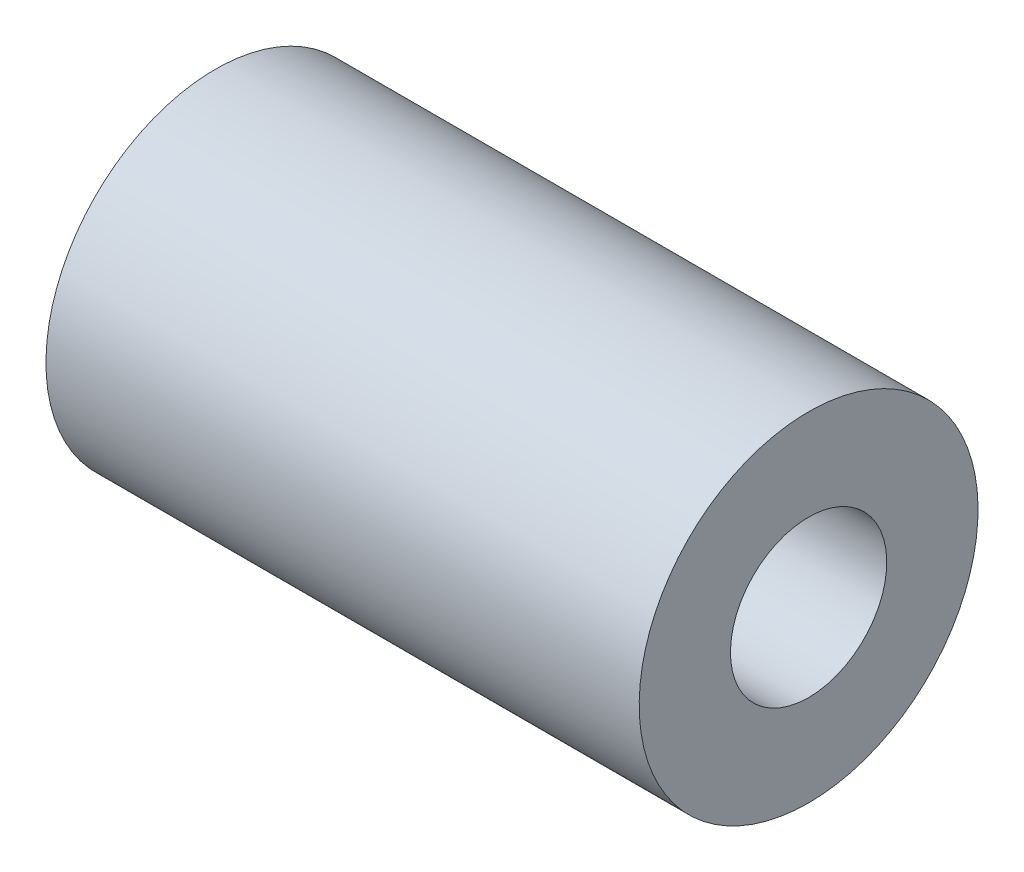
ISO-10303-21;
HEADER;
FILE_DESCRIPTION(('STEP AP214'),'2;1');
FILE_NAME('part.step','',(''),(''),'','','');
FILE_SCHEMA(('AUTOMOTIVE_DESIGN { 1 0 10303 214 1 1 1 1 }'));
ENDSEC;
DATA;
#1=APPLICATION_CONTEXT('core data for automotive mechanical design processes');
#2=APPLICATION_PROTOCOL_DEFINITION('international standard','automotive_design',2000,#1);
#3=PRODUCT_CONTEXT('',#1,'mechanical');
#4=PRODUCT('Part','Part','',(#3));
#5=PRODUCT_RELATED_PRODUCT_CATEGORY('part','',(#4));
#6=PRODUCT_DEFINITION_FORMATION('','',#4);
#7=PRODUCT_DEFINITION_CONTEXT('part definition',#1,'design');
#8=PRODUCT_DEFINITION('design','',#6,#7);
#9=PRODUCT_DEFINITION_SHAPE('','',#8);
#10=(LENGTH_UNIT() NAMED_UNIT(*) SI_UNIT(.MILLI.,.METRE.));
#11=(NAMED_UNIT(*) PLANE_ANGLE_UNIT() SI_UNIT($,.RADIAN.));
#12=(NAMED_UNIT(*) SI_UNIT($,.STERADIAN.) SOLID_ANGLE_UNIT());
#13=UNCERTAINTY_MEASURE_WITH_UNIT(LENGTH_MEASURE(1.E-05),#10,'distance_accuracy_value','');
#14=(GEOMETRIC_REPRESENTATION_CONTEXT(3) GLOBAL_UNCERTAINTY_ASSIGNED_CONTEXT((#13)) GLOBAL_UNIT_ASSIGNED_CONTEXT((#10,
#11,#12)) REPRESENTATION_CONTEXT('',''));
#15=CARTESIAN_POINT('',(0.,0.,0.));
#16=DIRECTION('',(0.,0.,1.));
#17=DIRECTION('',(1.,0.,0.));
#18=AXIS2_PLACEMENT_3D('',#15,#16,#17);
#19=CARTESIAN_POINT('',(-112.26450703781,38.1,0.));
#20=DIRECTION('',(-1.,0.,0.));
#21=DIRECTION('',(0.,-1.,0.));
#22=AXIS2_PLACEMENT_3D('',#19,#20,#21);
#23=CYLINDRICAL_SURFACE('',#22,4.71520215422623);
#24=CARTESIAN_POINT('',(-81.7845070378096,38.1000000000001,0.));
#25=DIRECTION('',(-1.,0.,0.));
#26=DIRECTION('',(0.,-1.,0.));
#27=AXIS2_PLACEMENT_3D('',#24,#25,#26);
#28=CIRCLE('',#27,4.71520215422621);
#29=CARTESIAN_POINT('',(-81.7845070378096,33.3847978457738,0.));
#30=VERTEX_POINT('',#29);
#31=EDGE_CURVE('E51',#30,#30,#28,.T.);
#32=ORIENTED_EDGE('',*,*,#31,.T.);
#33=EDGE_LOOP('',(#32));
#34=FACE_BOUND('',#33,.T.);
#35=CARTESIAN_POINT('',(-98.2945070378096,38.1,0.));
#36=DIRECTION('',(-1.,0.,0.));
#37=DIRECTION('',(0.,-1.,0.));
#38=AXIS2_PLACEMENT_3D('',#35,#36,#37);
#39=CIRCLE('',#38,4.71520215422625);
#40=CARTESIAN_POINT('',(-98.2945070378096,33.3847978457738,0.));
#41=VERTEX_POINT('',#40);
#42=EDGE_CURVE('E10',#41,#41,#39,.T.);
#43=ORIENTED_EDGE('',*,*,#42,.F.);
#44=EDGE_LOOP('',(#43));
#45=FACE_BOUND('',#44,.T.);
#46=ADVANCED_FACE('F37',(#34,#45),#23,.T.);
#47=CARTESIAN_POINT('',(-98.2945070378095,0.,0.));
#48=DIRECTION('',(1.,0.,0.));
#49=DIRECTION('',(0.,1.,0.));
#50=AXIS2_PLACEMENT_3D('',#47,#48,#49);
#51=PLANE('',#50);
#52=CARTESIAN_POINT('',(-98.2945070378096,38.1,0.));
#53=DIRECTION('',(-1.,0.,0.));
#54=DIRECTION('',(0.,-1.,0.));
#55=AXIS2_PLACEMENT_3D('',#52,#53,#54);
#56=CIRCLE('',#55,2.17520215422625);
#57=CARTESIAN_POINT('',(-98.2945070378096,35.9247978457738,0.));
#58=VERTEX_POINT('',#57);
#59=EDGE_CURVE('E43',#58,#58,#56,.T.);
#60=ORIENTED_EDGE('',*,*,#59,.F.);
#61=EDGE_LOOP('',(#60));
#62=FACE_BOUND('',#61,.T.);
#63=ORIENTED_EDGE('',*,*,#42,.T.);
#64=EDGE_LOOP('',(#63));
#65=FACE_BOUND('',#64,.T.);
#66=ADVANCED_FACE('F67',(#62,#65),#51,.F.);
#67=CARTESIAN_POINT('',(-112.26450703781,38.1,0.));
#68=DIRECTION('',(-1.,0.,0.));
#69=DIRECTION('',(0.,-1.,0.));
#70=AXIS2_PLACEMENT_3D('',#67,#68,#69);
#71=CYLINDRICAL_SURFACE('',#70,2.17520215422623);
#72=ORIENTED_EDGE('',*,*,#59,.T.);
#73=EDGE_LOOP('',(#72));
#74=FACE_BOUND('',#73,.T.);
#75=CARTESIAN_POINT('',(-81.7845070378096,38.1000000000001,0.));
#76=DIRECTION('',(-1.,0.,0.));
#77=DIRECTION('',(0.,-1.,0.));
#78=AXIS2_PLACEMENT_3D('',#75,#76,#77);
#79=CIRCLE('',#78,2.17520215422621);
#80=CARTESIAN_POINT('',(-81.7845070378096,35.9247978457738,0.));
#81=VERTEX_POINT('',#80);
#82=EDGE_CURVE('E47',#81,#81,#79,.T.);
#83=ORIENTED_EDGE('',*,*,#82,.F.);
#84=EDGE_LOOP('',(#83));
#85=FACE_BOUND('',#84,.T.);
#86=ADVANCED_FACE('F61',(#74,#85),#71,.F.);
#87=CARTESIAN_POINT('',(-81.7845070378095,0.,0.));
#88=DIRECTION('',(1.,0.,0.));
#89=DIRECTION('',(0.,1.,0.));
#90=AXIS2_PLACEMENT_3D('',#87,#88,#89);
#91=PLANE('',#90);
#92=ORIENTED_EDGE('',*,*,#82,.T.);
#93=EDGE_LOOP('',(#92));
#94=FACE_BOUND('',#93,.T.);
#95=ORIENTED_EDGE('',*,*,#31,.F.);
#96=EDGE_LOOP('',(#95));
#97=FACE_BOUND('',#96,.T.);
#98=ADVANCED_FACE('F59',(#94,#97),#91,.T.);
#99=CLOSED_SHELL('',(#46,#66,#86,#98));
#100=MANIFOLD_SOLID_BREP('B2',#99);
#101=ADVANCED_BREP_SHAPE_REPRESENTATION('',(#18,#100),#14);
#102=SHAPE_DEFINITION_REPRESENTATION(#9,#101);
ENDSEC;
END-ISO-10303-21;
